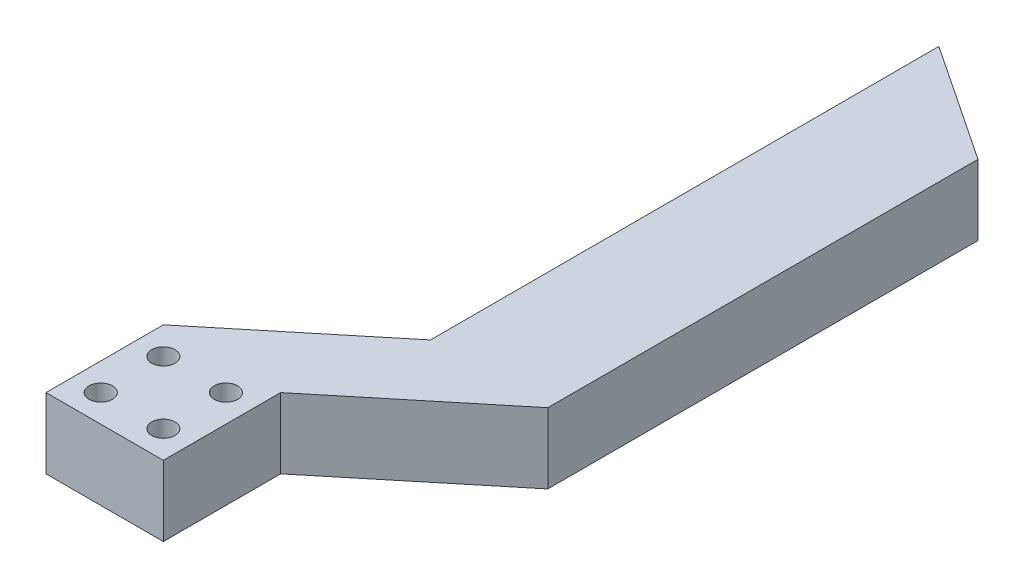
ISO-10303-21;
HEADER;
FILE_DESCRIPTION(('STEP AP214'),'2;1');
FILE_NAME('part.step','',(''),(''),'','','');
FILE_SCHEMA(('AUTOMOTIVE_DESIGN { 1 0 10303 214 1 1 1 1 }'));
ENDSEC;
DATA;
#1=APPLICATION_CONTEXT('core data for automotive mechanical design processes');
#2=APPLICATION_PROTOCOL_DEFINITION('international standard','automotive_design',2000,#1);
#3=PRODUCT_CONTEXT('',#1,'mechanical');
#4=PRODUCT('Part','Part','',(#3));
#5=PRODUCT_RELATED_PRODUCT_CATEGORY('part','',(#4));
#6=PRODUCT_DEFINITION_FORMATION('','',#4);
#7=PRODUCT_DEFINITION_CONTEXT('part definition',#1,'design');
#8=PRODUCT_DEFINITION('design','',#6,#7);
#9=PRODUCT_DEFINITION_SHAPE('','',#8);
#10=(LENGTH_UNIT() NAMED_UNIT(*) SI_UNIT(.MILLI.,.METRE.));
#11=(NAMED_UNIT(*) PLANE_ANGLE_UNIT() SI_UNIT($,.RADIAN.));
#12=(NAMED_UNIT(*) SI_UNIT($,.STERADIAN.) SOLID_ANGLE_UNIT());
#13=UNCERTAINTY_MEASURE_WITH_UNIT(LENGTH_MEASURE(1.E-05),#10,'distance_accuracy_value','');
#14=(GEOMETRIC_REPRESENTATION_CONTEXT(3) GLOBAL_UNCERTAINTY_ASSIGNED_CONTEXT((#13)) GLOBAL_UNIT_ASSIGNED_CONTEXT((#10,
#11,#12)) REPRESENTATION_CONTEXT('',''));
#15=CARTESIAN_POINT('',(0.,0.,0.));
#16=DIRECTION('',(0.,0.,1.));
#17=DIRECTION('',(1.,0.,0.));
#18=AXIS2_PLACEMENT_3D('',#15,#16,#17);
#19=CARTESIAN_POINT('',(0.,9.,0.));
#20=DIRECTION('',(0.,-1.,0.));
#21=DIRECTION('',(0.,0.,-1.));
#22=AXIS2_PLACEMENT_3D('',#19,#20,#21);
#23=PLANE('',#22);
#24=DIRECTION('',(0.772675976397421,0.,-0.634800626573645));
#25=VECTOR('',#24,1.);
#26=CARTESIAN_POINT('',(22.75,9.,-7.5));
#27=LINE('',#26,#25);
#28=CARTESIAN_POINT('',(22.75,9.,-7.5));
#29=VERTEX_POINT('',#28);
#30=CARTESIAN_POINT('',(41.5,9.,-22.9042730870849));
#31=VERTEX_POINT('',#30);
#32=EDGE_CURVE('E169',#29,#31,#27,.T.);
#33=ORIENTED_EDGE('',*,*,#32,.T.);
#34=DIRECTION('',(0.,0.,-1.));
#35=VECTOR('',#34,1.);
#36=CARTESIAN_POINT('',(41.5,9.,-77.9042730870849));
#37=LINE('',#36,#35);
#38=CARTESIAN_POINT('',(41.5,9.,-77.9042730870849));
#39=VERTEX_POINT('',#38);
#40=EDGE_CURVE('E104',#31,#39,#37,.T.);
#41=ORIENTED_EDGE('',*,*,#40,.T.);
#42=DIRECTION('',(-0.832050294337844,0.,-0.554700196225229));
#43=VECTOR('',#42,1.);
#44=CARTESIAN_POINT('',(26.5,9.,-87.9042730870849));
#45=LINE('',#44,#43);
#46=CARTESIAN_POINT('',(26.5,9.,-87.9042730870849));
#47=VERTEX_POINT('',#46);
#48=EDGE_CURVE('E190',#39,#47,#45,.T.);
#49=ORIENTED_EDGE('',*,*,#48,.T.);
#50=DIRECTION('',(0.,0.,1.));
#51=VECTOR('',#50,1.);
#52=CARTESIAN_POINT('',(26.5,9.,-77.9042730870849));
#53=LINE('',#52,#51);
#54=CARTESIAN_POINT('',(26.5,9.,-22.9042730870849));
#55=VERTEX_POINT('',#54);
#56=EDGE_CURVE('E203',#47,#55,#53,.T.);
#57=ORIENTED_EDGE('',*,*,#56,.T.);
#58=DIRECTION('',(-0.772675976397421,0.,0.634800626573645));
#59=VECTOR('',#58,1.);
#60=CARTESIAN_POINT('',(7.75,9.,-7.5));
#61=LINE('',#60,#59);
#62=CARTESIAN_POINT('',(7.75,9.,-7.5));
#63=VERTEX_POINT('',#62);
#64=EDGE_CURVE('E123',#55,#63,#61,.T.);
#65=ORIENTED_EDGE('',*,*,#64,.T.);
#66=DIRECTION('',(0.,0.,1.));
#67=VECTOR('',#66,1.);
#68=CARTESIAN_POINT('',(7.75,9.,7.5));
#69=LINE('',#68,#67);
#70=CARTESIAN_POINT('',(7.75,9.,7.5));
#71=VERTEX_POINT('',#70);
#72=EDGE_CURVE('E117',#63,#71,#69,.T.);
#73=ORIENTED_EDGE('',*,*,#72,.T.);
#74=DIRECTION('',(1.,0.,0.));
#75=VECTOR('',#74,1.);
#76=CARTESIAN_POINT('',(7.75,9.,7.5));
#77=LINE('',#76,#75);
#78=CARTESIAN_POINT('',(22.75,9.,7.5));
#79=VERTEX_POINT('',#78);
#80=EDGE_CURVE('E121',#71,#79,#77,.T.);
#81=ORIENTED_EDGE('',*,*,#80,.T.);
#82=DIRECTION('',(0.,0.,-1.));
#83=VECTOR('',#82,1.);
#84=CARTESIAN_POINT('',(22.75,9.,7.5));
#85=LINE('',#84,#83);
#86=EDGE_CURVE('E61',#79,#29,#85,.T.);
#87=ORIENTED_EDGE('',*,*,#86,.T.);
#88=EDGE_LOOP('',(#33,#41,#49,#57,#65,#73,#81,#87));
#89=FACE_BOUND('',#88,.T.);
#90=CARTESIAN_POINT('',(19.25,9.,-4.));
#91=DIRECTION('',(0.,1.,0.));
#92=DIRECTION('',(0.,0.,1.));
#93=AXIS2_PLACEMENT_3D('',#90,#91,#92);
#94=CIRCLE('',#93,1.5);
#95=CARTESIAN_POINT('',(19.25,9.,-2.5));
#96=VERTEX_POINT('',#95);
#97=EDGE_CURVE('E150',#96,#96,#94,.T.);
#98=ORIENTED_EDGE('',*,*,#97,.F.);
#99=EDGE_LOOP('',(#98));
#100=FACE_BOUND('',#99,.T.);
#101=CARTESIAN_POINT('',(19.2500000000001,9.,4.00000000000001));
#102=DIRECTION('',(0.,1.,0.));
#103=DIRECTION('',(0.,0.,1.));
#104=AXIS2_PLACEMENT_3D('',#101,#102,#103);
#105=CIRCLE('',#104,1.50000000000001);
#106=CARTESIAN_POINT('',(19.2500000000001,9.,5.50000000000001));
#107=VERTEX_POINT('',#106);
#108=EDGE_CURVE('E217',#107,#107,#105,.T.);
#109=ORIENTED_EDGE('',*,*,#108,.F.);
#110=EDGE_LOOP('',(#109));
#111=FACE_BOUND('',#110,.T.);
#112=CARTESIAN_POINT('',(11.2500000000001,9.,4.00000000000009));
#113=DIRECTION('',(0.,1.,0.));
#114=DIRECTION('',(0.,0.,1.));
#115=AXIS2_PLACEMENT_3D('',#112,#113,#114);
#116=CIRCLE('',#115,1.5);
#117=CARTESIAN_POINT('',(11.2500000000001,9.,5.50000000000009));
#118=VERTEX_POINT('',#117);
#119=EDGE_CURVE('E225',#118,#118,#116,.T.);
#120=ORIENTED_EDGE('',*,*,#119,.F.);
#121=EDGE_LOOP('',(#120));
#122=FACE_BOUND('',#121,.T.);
#123=CARTESIAN_POINT('',(11.25,9.,-3.9999999999999));
#124=DIRECTION('',(0.,1.,0.));
#125=DIRECTION('',(0.,0.,1.));
#126=AXIS2_PLACEMENT_3D('',#123,#124,#125);
#127=CIRCLE('',#126,1.50000000000002);
#128=CARTESIAN_POINT('',(11.25,9.,-2.49999999999988));
#129=VERTEX_POINT('',#128);
#130=EDGE_CURVE('E233',#129,#129,#127,.T.);
#131=ORIENTED_EDGE('',*,*,#130,.F.);
#132=EDGE_LOOP('',(#131));
#133=FACE_BOUND('',#132,.T.);
#134=ADVANCED_FACE('F43',(#89,#100,#111,#122,#133),#23,.F.);
#135=CARTESIAN_POINT('',(0.,0.,0.));
#136=DIRECTION('',(0.,-1.,0.));
#137=DIRECTION('',(0.,0.,-1.));
#138=AXIS2_PLACEMENT_3D('',#135,#136,#137);
#139=PLANE('',#138);
#140=CARTESIAN_POINT('',(11.2500000000001,0.,4.00000000000009));
#141=DIRECTION('',(0.,1.,0.));
#142=DIRECTION('',(0.,0.,1.));
#143=AXIS2_PLACEMENT_3D('',#140,#141,#142);
#144=CIRCLE('',#143,1.5);
#145=CARTESIAN_POINT('',(11.2500000000001,0.,5.50000000000009));
#146=VERTEX_POINT('',#145);
#147=EDGE_CURVE('E229',#146,#146,#144,.T.);
#148=ORIENTED_EDGE('',*,*,#147,.T.);
#149=EDGE_LOOP('',(#148));
#150=FACE_BOUND('',#149,.T.);
#151=CARTESIAN_POINT('',(19.25,0.,-4.));
#152=DIRECTION('',(0.,1.,0.));
#153=DIRECTION('',(0.,0.,1.));
#154=AXIS2_PLACEMENT_3D('',#151,#152,#153);
#155=CIRCLE('',#154,1.5);
#156=CARTESIAN_POINT('',(19.25,0.,-2.5));
#157=VERTEX_POINT('',#156);
#158=EDGE_CURVE('E213',#157,#157,#155,.T.);
#159=ORIENTED_EDGE('',*,*,#158,.T.);
#160=EDGE_LOOP('',(#159));
#161=FACE_BOUND('',#160,.T.);
#162=DIRECTION('',(0.772675976397421,0.,-0.634800626573645));
#163=VECTOR('',#162,1.);
#164=CARTESIAN_POINT('',(22.75,0.,-7.5));
#165=LINE('',#164,#163);
#166=CARTESIAN_POINT('',(22.75,0.,-7.5));
#167=VERTEX_POINT('',#166);
#168=CARTESIAN_POINT('',(41.5,0.,-22.9042730870849));
#169=VERTEX_POINT('',#168);
#170=EDGE_CURVE('E145',#167,#169,#165,.T.);
#171=ORIENTED_EDGE('',*,*,#170,.F.);
#172=DIRECTION('',(0.,0.,-1.));
#173=VECTOR('',#172,1.);
#174=CARTESIAN_POINT('',(22.75,0.,7.5));
#175=LINE('',#174,#173);
#176=CARTESIAN_POINT('',(22.75,0.,7.5));
#177=VERTEX_POINT('',#176);
#178=EDGE_CURVE('E96',#177,#167,#175,.T.);
#179=ORIENTED_EDGE('',*,*,#178,.F.);
#180=DIRECTION('',(1.,0.,0.));
#181=VECTOR('',#180,1.);
#182=CARTESIAN_POINT('',(7.75,0.,7.5));
#183=LINE('',#182,#181);
#184=CARTESIAN_POINT('',(7.75,0.,7.5));
#185=VERTEX_POINT('',#184);
#186=EDGE_CURVE('E90',#185,#177,#183,.T.);
#187=ORIENTED_EDGE('',*,*,#186,.F.);
#188=DIRECTION('',(0.,0.,1.));
#189=VECTOR('',#188,1.);
#190=CARTESIAN_POINT('',(7.75,0.,7.5));
#191=LINE('',#190,#189);
#192=CARTESIAN_POINT('',(7.75,0.,-7.5));
#193=VERTEX_POINT('',#192);
#194=EDGE_CURVE('E132',#193,#185,#191,.T.);
#195=ORIENTED_EDGE('',*,*,#194,.F.);
#196=DIRECTION('',(-0.772675976397421,0.,0.634800626573645));
#197=VECTOR('',#196,1.);
#198=CARTESIAN_POINT('',(7.75,0.,-7.5));
#199=LINE('',#198,#197);
#200=CARTESIAN_POINT('',(26.5,0.,-22.9042730870849));
#201=VERTEX_POINT('',#200);
#202=EDGE_CURVE('E160',#201,#193,#199,.T.);
#203=ORIENTED_EDGE('',*,*,#202,.F.);
#204=DIRECTION('',(0.,0.,1.));
#205=VECTOR('',#204,1.);
#206=CARTESIAN_POINT('',(26.5,0.,-77.9042730870849));
#207=LINE('',#206,#205);
#208=CARTESIAN_POINT('',(26.5,0.,-87.9042730870849));
#209=VERTEX_POINT('',#208);
#210=EDGE_CURVE('E157',#209,#201,#207,.T.);
#211=ORIENTED_EDGE('',*,*,#210,.F.);
#212=DIRECTION('',(-0.832050294337844,0.,-0.554700196225229));
#213=VECTOR('',#212,1.);
#214=CARTESIAN_POINT('',(26.5,0.,-87.9042730870849));
#215=LINE('',#214,#213);
#216=CARTESIAN_POINT('',(41.5,0.,-77.9042730870849));
#217=VERTEX_POINT('',#216);
#218=EDGE_CURVE('E153',#217,#209,#215,.T.);
#219=ORIENTED_EDGE('',*,*,#218,.F.);
#220=DIRECTION('',(0.,0.,-1.));
#221=VECTOR('',#220,1.);
#222=CARTESIAN_POINT('',(41.5,0.,-77.9042730870849));
#223=LINE('',#222,#221);
#224=EDGE_CURVE('E149',#169,#217,#223,.T.);
#225=ORIENTED_EDGE('',*,*,#224,.F.);
#226=EDGE_LOOP('',(#171,#179,#187,#195,#203,#211,#219,#225));
#227=FACE_BOUND('',#226,.T.);
#228=CARTESIAN_POINT('',(19.2500000000001,0.,4.00000000000001));
#229=DIRECTION('',(0.,1.,0.));
#230=DIRECTION('',(0.,0.,1.));
#231=AXIS2_PLACEMENT_3D('',#228,#229,#230);
#232=CIRCLE('',#231,1.50000000000001);
#233=CARTESIAN_POINT('',(19.2500000000001,0.,5.50000000000001));
#234=VERTEX_POINT('',#233);
#235=EDGE_CURVE('E221',#234,#234,#232,.T.);
#236=ORIENTED_EDGE('',*,*,#235,.T.);
#237=EDGE_LOOP('',(#236));
#238=FACE_BOUND('',#237,.T.);
#239=CARTESIAN_POINT('',(11.25,0.,-3.9999999999999));
#240=DIRECTION('',(0.,1.,0.));
#241=DIRECTION('',(0.,0.,1.));
#242=AXIS2_PLACEMENT_3D('',#239,#240,#241);
#243=CIRCLE('',#242,1.50000000000002);
#244=CARTESIAN_POINT('',(11.25,0.,-2.49999999999988));
#245=VERTEX_POINT('',#244);
#246=EDGE_CURVE('E237',#245,#245,#243,.T.);
#247=ORIENTED_EDGE('',*,*,#246,.T.);
#248=EDGE_LOOP('',(#247));
#249=FACE_BOUND('',#248,.T.);
#250=ADVANCED_FACE('F193',(#150,#161,#227,#238,#249),#139,.T.);
#251=CARTESIAN_POINT('',(22.75,9.,-7.5));
#252=DIRECTION('',(-0.634800626573645,0.,-0.772675976397421));
#253=DIRECTION('',(-0.772675976397421,0.,0.634800626573645));
#254=AXIS2_PLACEMENT_3D('',#251,#252,#253);
#255=PLANE('',#254);
#256=ORIENTED_EDGE('',*,*,#170,.T.);
#257=DIRECTION('',(0.,-1.,0.));
#258=VECTOR('',#257,1.);
#259=CARTESIAN_POINT('',(41.5,9.,-22.9042730870849));
#260=LINE('',#259,#258);
#261=EDGE_CURVE('E11',#31,#169,#260,.T.);
#262=ORIENTED_EDGE('',*,*,#261,.F.);
#263=ORIENTED_EDGE('',*,*,#32,.F.);
#264=DIRECTION('',(0.,-1.,0.));
#265=VECTOR('',#264,1.);
#266=CARTESIAN_POINT('',(22.75,9.,-7.5));
#267=LINE('',#266,#265);
#268=EDGE_CURVE('E141',#29,#167,#267,.T.);
#269=ORIENTED_EDGE('',*,*,#268,.T.);
#270=EDGE_LOOP('',(#256,#262,#263,#269));
#271=FACE_BOUND('',#270,.T.);
#272=ADVANCED_FACE('F45',(#271),#255,.F.);
#273=CARTESIAN_POINT('',(41.5,9.,-77.9042730870849));
#274=DIRECTION('',(-1.,0.,0.));
#275=DIRECTION('',(0.,0.,1.));
#276=AXIS2_PLACEMENT_3D('',#273,#274,#275);
#277=PLANE('',#276);
#278=ORIENTED_EDGE('',*,*,#224,.T.);
#279=DIRECTION('',(0.,-1.,0.));
#280=VECTOR('',#279,1.);
#281=CARTESIAN_POINT('',(41.5,9.,-77.9042730870849));
#282=LINE('',#281,#280);
#283=EDGE_CURVE('E53',#39,#217,#282,.T.);
#284=ORIENTED_EDGE('',*,*,#283,.F.);
#285=ORIENTED_EDGE('',*,*,#40,.F.);
#286=ORIENTED_EDGE('',*,*,#261,.T.);
#287=EDGE_LOOP('',(#278,#284,#285,#286));
#288=FACE_BOUND('',#287,.T.);
#289=ADVANCED_FACE('F271',(#288),#277,.F.);
#290=CARTESIAN_POINT('',(26.5,9.,-87.9042730870849));
#291=DIRECTION('',(-0.554700196225229,0.,0.832050294337844));
#292=DIRECTION('',(0.832050294337844,0.,0.554700196225229));
#293=AXIS2_PLACEMENT_3D('',#290,#291,#292);
#294=PLANE('',#293);
#295=ORIENTED_EDGE('',*,*,#218,.T.);
#296=DIRECTION('',(0.,-1.,0.));
#297=VECTOR('',#296,1.);
#298=CARTESIAN_POINT('',(26.5,9.,-87.9042730870849));
#299=LINE('',#298,#297);
#300=EDGE_CURVE('E180',#47,#209,#299,.T.);
#301=ORIENTED_EDGE('',*,*,#300,.F.);
#302=ORIENTED_EDGE('',*,*,#48,.F.);
#303=ORIENTED_EDGE('',*,*,#283,.T.);
#304=EDGE_LOOP('',(#295,#301,#302,#303));
#305=FACE_BOUND('',#304,.T.);
#306=ADVANCED_FACE('F188',(#305),#294,.F.);
#307=CARTESIAN_POINT('',(26.5,9.,-77.9042730870849));
#308=DIRECTION('',(1.,0.,0.));
#309=DIRECTION('',(0.,0.,-1.));
#310=AXIS2_PLACEMENT_3D('',#307,#308,#309);
#311=PLANE('',#310);
#312=ORIENTED_EDGE('',*,*,#210,.T.);
#313=DIRECTION('',(0.,-1.,0.));
#314=VECTOR('',#313,1.);
#315=CARTESIAN_POINT('',(26.5,9.,-22.9042730870849));
#316=LINE('',#315,#314);
#317=EDGE_CURVE('E176',#55,#201,#316,.T.);
#318=ORIENTED_EDGE('',*,*,#317,.F.);
#319=ORIENTED_EDGE('',*,*,#56,.F.);
#320=ORIENTED_EDGE('',*,*,#300,.T.);
#321=EDGE_LOOP('',(#312,#318,#319,#320));
#322=FACE_BOUND('',#321,.T.);
#323=ADVANCED_FACE('F198',(#322),#311,.F.);
#324=CARTESIAN_POINT('',(7.75,9.,-7.5));
#325=DIRECTION('',(0.634800626573645,0.,0.772675976397421));
#326=DIRECTION('',(0.772675976397421,0.,-0.634800626573645));
#327=AXIS2_PLACEMENT_3D('',#324,#325,#326);
#328=PLANE('',#327);
#329=ORIENTED_EDGE('',*,*,#202,.T.);
#330=DIRECTION('',(0.,-1.,0.));
#331=VECTOR('',#330,1.);
#332=CARTESIAN_POINT('',(7.75,9.,-7.5));
#333=LINE('',#332,#331);
#334=EDGE_CURVE('E134',#63,#193,#333,.T.);
#335=ORIENTED_EDGE('',*,*,#334,.F.);
#336=ORIENTED_EDGE('',*,*,#64,.F.);
#337=ORIENTED_EDGE('',*,*,#317,.T.);
#338=EDGE_LOOP('',(#329,#335,#336,#337));
#339=FACE_BOUND('',#338,.T.);
#340=ADVANCED_FACE('F201',(#339),#328,.F.);
#341=CARTESIAN_POINT('',(7.75,9.,7.5));
#342=DIRECTION('',(1.,0.,0.));
#343=DIRECTION('',(0.,0.,-1.));
#344=AXIS2_PLACEMENT_3D('',#341,#342,#343);
#345=PLANE('',#344);
#346=ORIENTED_EDGE('',*,*,#194,.T.);
#347=DIRECTION('',(0.,-1.,0.));
#348=VECTOR('',#347,1.);
#349=CARTESIAN_POINT('',(7.75,9.,7.5));
#350=LINE('',#349,#348);
#351=EDGE_CURVE('E129',#71,#185,#350,.T.);
#352=ORIENTED_EDGE('',*,*,#351,.F.);
#353=ORIENTED_EDGE('',*,*,#72,.F.);
#354=ORIENTED_EDGE('',*,*,#334,.T.);
#355=EDGE_LOOP('',(#346,#352,#353,#354));
#356=FACE_BOUND('',#355,.T.);
#357=ADVANCED_FACE('F130',(#356),#345,.F.);
#358=CARTESIAN_POINT('',(7.75,9.,7.5));
#359=DIRECTION('',(0.,0.,-1.));
#360=DIRECTION('',(-1.,0.,0.));
#361=AXIS2_PLACEMENT_3D('',#358,#359,#360);
#362=PLANE('',#361);
#363=ORIENTED_EDGE('',*,*,#186,.T.);
#364=DIRECTION('',(0.,-1.,0.));
#365=VECTOR('',#364,1.);
#366=CARTESIAN_POINT('',(22.75,9.,7.5));
#367=LINE('',#366,#365);
#368=EDGE_CURVE('E135',#79,#177,#367,.T.);
#369=ORIENTED_EDGE('',*,*,#368,.F.);
#370=ORIENTED_EDGE('',*,*,#80,.F.);
#371=ORIENTED_EDGE('',*,*,#351,.T.);
#372=EDGE_LOOP('',(#363,#369,#370,#371));
#373=FACE_BOUND('',#372,.T.);
#374=ADVANCED_FACE('F137',(#373),#362,.F.);
#375=CARTESIAN_POINT('',(22.75,9.,7.5));
#376=DIRECTION('',(-1.,0.,0.));
#377=DIRECTION('',(0.,0.,1.));
#378=AXIS2_PLACEMENT_3D('',#375,#376,#377);
#379=PLANE('',#378);
#380=ORIENTED_EDGE('',*,*,#178,.T.);
#381=ORIENTED_EDGE('',*,*,#268,.F.);
#382=ORIENTED_EDGE('',*,*,#86,.F.);
#383=ORIENTED_EDGE('',*,*,#368,.T.);
#384=EDGE_LOOP('',(#380,#381,#382,#383));
#385=FACE_BOUND('',#384,.T.);
#386=ADVANCED_FACE('F259',(#385),#379,.F.);
#387=CARTESIAN_POINT('',(19.25,9.,-4.));
#388=DIRECTION('',(0.,-1.,0.));
#389=DIRECTION('',(0.,0.,-1.));
#390=AXIS2_PLACEMENT_3D('',#387,#388,#389);
#391=CYLINDRICAL_SURFACE('',#390,1.5);
#392=ORIENTED_EDGE('',*,*,#97,.T.);
#393=EDGE_LOOP('',(#392));
#394=FACE_BOUND('',#393,.T.);
#395=ORIENTED_EDGE('',*,*,#158,.F.);
#396=EDGE_LOOP('',(#395));
#397=FACE_BOUND('',#396,.T.);
#398=ADVANCED_FACE('F256',(#394,#397),#391,.F.);
#399=CARTESIAN_POINT('',(19.2500000000001,9.,4.00000000000001));
#400=DIRECTION('',(0.,-1.,0.));
#401=DIRECTION('',(0.,0.,-1.));
#402=AXIS2_PLACEMENT_3D('',#399,#400,#401);
#403=CYLINDRICAL_SURFACE('',#402,1.50000000000001);
#404=ORIENTED_EDGE('',*,*,#108,.T.);
#405=EDGE_LOOP('',(#404));
#406=FACE_BOUND('',#405,.T.);
#407=ORIENTED_EDGE('',*,*,#235,.F.);
#408=EDGE_LOOP('',(#407));
#409=FACE_BOUND('',#408,.T.);
#410=ADVANCED_FACE('F347',(#406,#409),#403,.F.);
#411=CARTESIAN_POINT('',(11.2500000000001,9.,4.00000000000009));
#412=DIRECTION('',(0.,-1.,0.));
#413=DIRECTION('',(0.,0.,-1.));
#414=AXIS2_PLACEMENT_3D('',#411,#412,#413);
#415=CYLINDRICAL_SURFACE('',#414,1.5);
#416=ORIENTED_EDGE('',*,*,#119,.T.);
#417=EDGE_LOOP('',(#416));
#418=FACE_BOUND('',#417,.T.);
#419=ORIENTED_EDGE('',*,*,#147,.F.);
#420=EDGE_LOOP('',(#419));
#421=FACE_BOUND('',#420,.T.);
#422=ADVANCED_FACE('F356',(#418,#421),#415,.F.);
#423=CARTESIAN_POINT('',(11.25,9.,-3.9999999999999));
#424=DIRECTION('',(0.,-1.,0.));
#425=DIRECTION('',(0.,0.,-1.));
#426=AXIS2_PLACEMENT_3D('',#423,#424,#425);
#427=CYLINDRICAL_SURFACE('',#426,1.50000000000002);
#428=ORIENTED_EDGE('',*,*,#130,.T.);
#429=EDGE_LOOP('',(#428));
#430=FACE_BOUND('',#429,.T.);
#431=ORIENTED_EDGE('',*,*,#246,.F.);
#432=EDGE_LOOP('',(#431));
#433=FACE_BOUND('',#432,.T.);
#434=ADVANCED_FACE('F245',(#430,#433),#427,.F.);
#435=CLOSED_SHELL('',(#134,#250,#272,#289,#306,#323,#340,#357,#374,#386,#398,#410,#422,#434));
#436=MANIFOLD_SOLID_BREP('B2',#435);
#437=ADVANCED_BREP_SHAPE_REPRESENTATION('',(#18,#436),#14);
#438=SHAPE_DEFINITION_REPRESENTATION(#9,#437);
ENDSEC;
END-ISO-10303-21;
